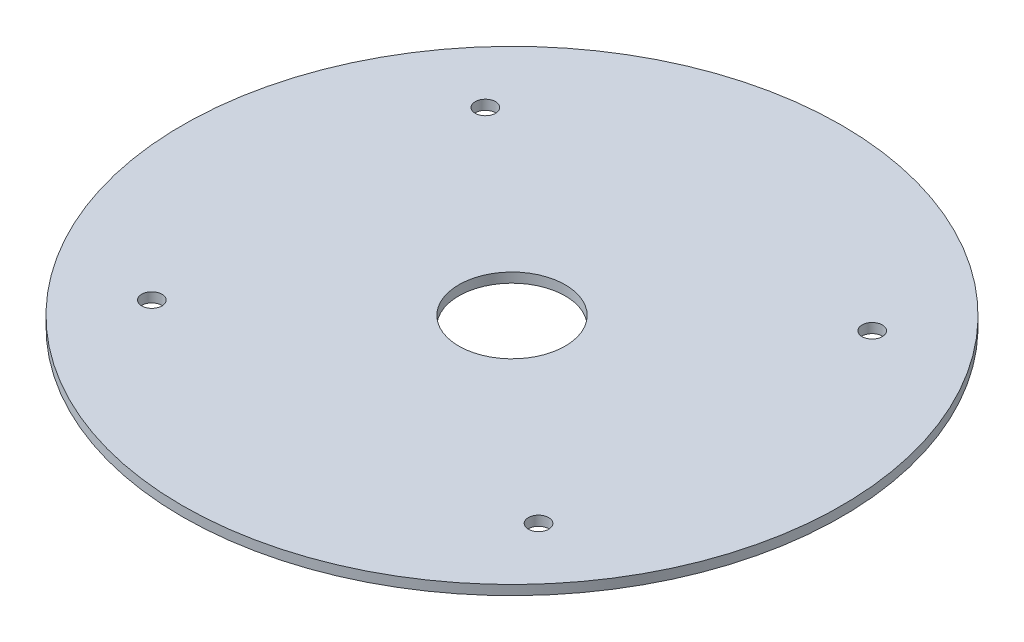
ISO-10303-21;
HEADER;
FILE_DESCRIPTION(('STEP AP214'),'2;1');
FILE_NAME('part.step','',(''),(''),'','','');
FILE_SCHEMA(('AUTOMOTIVE_DESIGN { 1 0 10303 214 1 1 1 1 }'));
ENDSEC;
DATA;
#1=APPLICATION_CONTEXT('core data for automotive mechanical design processes');
#2=APPLICATION_PROTOCOL_DEFINITION('international standard','automotive_design',2000,#1);
#3=PRODUCT_CONTEXT('',#1,'mechanical');
#4=PRODUCT('Part','Part','',(#3));
#5=PRODUCT_RELATED_PRODUCT_CATEGORY('part','',(#4));
#6=PRODUCT_DEFINITION_FORMATION('','',#4);
#7=PRODUCT_DEFINITION_CONTEXT('part definition',#1,'design');
#8=PRODUCT_DEFINITION('design','',#6,#7);
#9=PRODUCT_DEFINITION_SHAPE('','',#8);
#10=(LENGTH_UNIT() NAMED_UNIT(*) SI_UNIT(.MILLI.,.METRE.));
#11=(NAMED_UNIT(*) PLANE_ANGLE_UNIT() SI_UNIT($,.RADIAN.));
#12=(NAMED_UNIT(*) SI_UNIT($,.STERADIAN.) SOLID_ANGLE_UNIT());
#13=UNCERTAINTY_MEASURE_WITH_UNIT(LENGTH_MEASURE(1.E-05),#10,'distance_accuracy_value','');
#14=(GEOMETRIC_REPRESENTATION_CONTEXT(3) GLOBAL_UNCERTAINTY_ASSIGNED_CONTEXT((#13)) GLOBAL_UNIT_ASSIGNED_CONTEXT((#10,
#11,#12)) REPRESENTATION_CONTEXT('',''));
#15=CARTESIAN_POINT('',(0.,0.,0.));
#16=DIRECTION('',(0.,0.,1.));
#17=DIRECTION('',(1.,0.,0.));
#18=AXIS2_PLACEMENT_3D('',#15,#16,#17);
#19=CARTESIAN_POINT('',(6.79138855438484,2.,-8.0652010270864));
#20=DIRECTION('',(0.,1.,0.));
#21=DIRECTION('',(0.,0.,1.));
#22=AXIS2_PLACEMENT_3D('',#19,#20,#21);
#23=PLANE('',#22);
#24=CARTESIAN_POINT('',(-33.2088446067296,2.,26.4347989729135));
#25=DIRECTION('',(0.,1.,0.));
#26=DIRECTION('',(0.,0.,1.));
#27=AXIS2_PLACEMENT_3D('',#24,#25,#26);
#28=CIRCLE('',#27,2.1);
#29=CARTESIAN_POINT('',(-33.2088446067296,2.,28.5347989729135));
#30=VERTEX_POINT('',#29);
#31=EDGE_CURVE('E62',#30,#30,#28,.T.);
#32=ORIENTED_EDGE('',*,*,#31,.F.);
#33=EDGE_LOOP('',(#32));
#34=FACE_BOUND('',#33,.T.);
#35=CARTESIAN_POINT('',(-33.2088446067296,2.,-42.5652010270864));
#36=DIRECTION('',(0.,1.,0.));
#37=DIRECTION('',(0.,0.,1.));
#38=AXIS2_PLACEMENT_3D('',#35,#36,#37);
#39=CIRCLE('',#38,2.1);
#40=CARTESIAN_POINT('',(-33.2088446067296,2.,-40.4652010270864));
#41=VERTEX_POINT('',#40);
#42=EDGE_CURVE('E50',#41,#41,#39,.T.);
#43=ORIENTED_EDGE('',*,*,#42,.F.);
#44=EDGE_LOOP('',(#43));
#45=FACE_BOUND('',#44,.T.);
#46=CARTESIAN_POINT('',(6.79138855438484,2.,-8.0652010270864));
#47=DIRECTION('',(0.,1.,0.));
#48=DIRECTION('',(0.,0.,1.));
#49=AXIS2_PLACEMENT_3D('',#46,#47,#48);
#50=CIRCLE('',#49,68.1690216964452);
#51=CARTESIAN_POINT('',(6.79138855438484,2.,60.1038206693588));
#52=VERTEX_POINT('',#51);
#53=EDGE_CURVE('E10',#52,#52,#50,.T.);
#54=ORIENTED_EDGE('',*,*,#53,.T.);
#55=EDGE_LOOP('',(#54));
#56=FACE_BOUND('',#55,.T.);
#57=CARTESIAN_POINT('',(6.79138855438484,2.,-8.0652010270864));
#58=DIRECTION('',(0.,1.,0.));
#59=DIRECTION('',(0.,0.,1.));
#60=AXIS2_PLACEMENT_3D('',#57,#58,#59);
#61=CIRCLE('',#60,11.);
#62=CARTESIAN_POINT('',(6.79138855438484,2.,2.9347989729136));
#63=VERTEX_POINT('',#62);
#64=EDGE_CURVE('E45',#63,#63,#61,.T.);
#65=ORIENTED_EDGE('',*,*,#64,.F.);
#66=EDGE_LOOP('',(#65));
#67=FACE_BOUND('',#66,.T.);
#68=CARTESIAN_POINT('',(46.7916217154993,2.,-42.5652010270864));
#69=DIRECTION('',(0.,1.,0.));
#70=DIRECTION('',(0.,0.,1.));
#71=AXIS2_PLACEMENT_3D('',#68,#69,#70);
#72=CIRCLE('',#71,2.1);
#73=CARTESIAN_POINT('',(46.7916217154993,2.,-40.4652010270864));
#74=VERTEX_POINT('',#73);
#75=EDGE_CURVE('E56',#74,#74,#72,.T.);
#76=ORIENTED_EDGE('',*,*,#75,.F.);
#77=EDGE_LOOP('',(#76));
#78=FACE_BOUND('',#77,.T.);
#79=CARTESIAN_POINT('',(46.7960018184228,2.,26.4508327700433));
#80=DIRECTION('',(0.,1.,0.));
#81=DIRECTION('',(0.,0.,1.));
#82=AXIS2_PLACEMENT_3D('',#79,#80,#81);
#83=CIRCLE('',#82,2.1);
#84=CARTESIAN_POINT('',(46.7960018184228,2.,28.5508327700433));
#85=VERTEX_POINT('',#84);
#86=EDGE_CURVE('E68',#85,#85,#83,.T.);
#87=ORIENTED_EDGE('',*,*,#86,.F.);
#88=EDGE_LOOP('',(#87));
#89=FACE_BOUND('',#88,.T.);
#90=ADVANCED_FACE('F34',(#34,#45,#56,#67,#78,#89),#23,.T.);
#91=CARTESIAN_POINT('',(6.79138855438484,0.,-8.0652010270864));
#92=DIRECTION('',(0.,1.,0.));
#93=DIRECTION('',(0.,0.,1.));
#94=AXIS2_PLACEMENT_3D('',#91,#92,#93);
#95=PLANE('',#94);
#96=CARTESIAN_POINT('',(6.79138855438484,0.,-8.0652010270864));
#97=DIRECTION('',(0.,1.,0.));
#98=DIRECTION('',(0.,0.,1.));
#99=AXIS2_PLACEMENT_3D('',#96,#97,#98);
#100=CIRCLE('',#99,68.1690216964452);
#101=CARTESIAN_POINT('',(6.79138855438484,0.,60.1038206693588));
#102=VERTEX_POINT('',#101);
#103=EDGE_CURVE('E38',#102,#102,#100,.T.);
#104=ORIENTED_EDGE('',*,*,#103,.F.);
#105=EDGE_LOOP('',(#104));
#106=FACE_BOUND('',#105,.T.);
#107=CARTESIAN_POINT('',(6.79138855438484,0.,-8.0652010270864));
#108=DIRECTION('',(0.,1.,0.));
#109=DIRECTION('',(0.,0.,1.));
#110=AXIS2_PLACEMENT_3D('',#107,#108,#109);
#111=CIRCLE('',#110,11.);
#112=CARTESIAN_POINT('',(6.79138855438484,0.,2.9347989729136));
#113=VERTEX_POINT('',#112);
#114=EDGE_CURVE('E47',#113,#113,#111,.T.);
#115=ORIENTED_EDGE('',*,*,#114,.T.);
#116=EDGE_LOOP('',(#115));
#117=FACE_BOUND('',#116,.T.);
#118=CARTESIAN_POINT('',(-33.2088446067296,0.,-42.5652010270864));
#119=DIRECTION('',(0.,1.,0.));
#120=DIRECTION('',(0.,0.,1.));
#121=AXIS2_PLACEMENT_3D('',#118,#119,#120);
#122=CIRCLE('',#121,2.1);
#123=CARTESIAN_POINT('',(-33.2088446067296,0.,-40.4652010270864));
#124=VERTEX_POINT('',#123);
#125=EDGE_CURVE('E53',#124,#124,#122,.T.);
#126=ORIENTED_EDGE('',*,*,#125,.T.);
#127=EDGE_LOOP('',(#126));
#128=FACE_BOUND('',#127,.T.);
#129=CARTESIAN_POINT('',(46.7916217154993,0.,-42.5652010270864));
#130=DIRECTION('',(0.,1.,0.));
#131=DIRECTION('',(0.,0.,1.));
#132=AXIS2_PLACEMENT_3D('',#129,#130,#131);
#133=CIRCLE('',#132,2.1);
#134=CARTESIAN_POINT('',(46.7916217154993,0.,-40.4652010270864));
#135=VERTEX_POINT('',#134);
#136=EDGE_CURVE('E59',#135,#135,#133,.T.);
#137=ORIENTED_EDGE('',*,*,#136,.T.);
#138=EDGE_LOOP('',(#137));
#139=FACE_BOUND('',#138,.T.);
#140=CARTESIAN_POINT('',(-33.2088446067296,0.,26.4347989729135));
#141=DIRECTION('',(0.,1.,0.));
#142=DIRECTION('',(0.,0.,1.));
#143=AXIS2_PLACEMENT_3D('',#140,#141,#142);
#144=CIRCLE('',#143,2.1);
#145=CARTESIAN_POINT('',(-33.2088446067296,0.,28.5347989729135));
#146=VERTEX_POINT('',#145);
#147=EDGE_CURVE('E65',#146,#146,#144,.T.);
#148=ORIENTED_EDGE('',*,*,#147,.T.);
#149=EDGE_LOOP('',(#148));
#150=FACE_BOUND('',#149,.T.);
#151=CARTESIAN_POINT('',(46.7960018184228,0.,26.4508327700433));
#152=DIRECTION('',(0.,1.,0.));
#153=DIRECTION('',(0.,0.,1.));
#154=AXIS2_PLACEMENT_3D('',#151,#152,#153);
#155=CIRCLE('',#154,2.1);
#156=CARTESIAN_POINT('',(46.7960018184228,0.,28.5508327700433));
#157=VERTEX_POINT('',#156);
#158=EDGE_CURVE('E71',#157,#157,#155,.T.);
#159=ORIENTED_EDGE('',*,*,#158,.T.);
#160=EDGE_LOOP('',(#159));
#161=FACE_BOUND('',#160,.T.);
#162=ADVANCED_FACE('F81',(#106,#117,#128,#139,#150,#161),#95,.F.);
#163=CARTESIAN_POINT('',(6.79138855438484,2.,-8.0652010270864));
#164=DIRECTION('',(0.,-1.,0.));
#165=DIRECTION('',(0.,0.,-1.));
#166=AXIS2_PLACEMENT_3D('',#163,#164,#165);
#167=CYLINDRICAL_SURFACE('',#166,68.1690216964452);
#168=ORIENTED_EDGE('',*,*,#53,.F.);
#169=EDGE_LOOP('',(#168));
#170=FACE_BOUND('',#169,.T.);
#171=ORIENTED_EDGE('',*,*,#103,.T.);
#172=EDGE_LOOP('',(#171));
#173=FACE_BOUND('',#172,.T.);
#174=ADVANCED_FACE('F36',(#170,#173),#167,.T.);
#175=CARTESIAN_POINT('',(6.79138855438484,2.,-8.0652010270864));
#176=DIRECTION('',(0.,-1.,0.));
#177=DIRECTION('',(0.,0.,-1.));
#178=AXIS2_PLACEMENT_3D('',#175,#176,#177);
#179=CYLINDRICAL_SURFACE('',#178,11.);
#180=ORIENTED_EDGE('',*,*,#64,.T.);
#181=EDGE_LOOP('',(#180));
#182=FACE_BOUND('',#181,.T.);
#183=ORIENTED_EDGE('',*,*,#114,.F.);
#184=EDGE_LOOP('',(#183));
#185=FACE_BOUND('',#184,.T.);
#186=ADVANCED_FACE('F91',(#182,#185),#179,.F.);
#187=CARTESIAN_POINT('',(-33.2088446067296,2.,-42.5652010270864));
#188=DIRECTION('',(0.,-1.,0.));
#189=DIRECTION('',(0.,0.,-1.));
#190=AXIS2_PLACEMENT_3D('',#187,#188,#189);
#191=CYLINDRICAL_SURFACE('',#190,2.1);
#192=ORIENTED_EDGE('',*,*,#42,.T.);
#193=EDGE_LOOP('',(#192));
#194=FACE_BOUND('',#193,.T.);
#195=ORIENTED_EDGE('',*,*,#125,.F.);
#196=EDGE_LOOP('',(#195));
#197=FACE_BOUND('',#196,.T.);
#198=ADVANCED_FACE('F94',(#194,#197),#191,.F.);
#199=CARTESIAN_POINT('',(46.7916217154993,2.,-42.5652010270864));
#200=DIRECTION('',(0.,-1.,0.));
#201=DIRECTION('',(0.,0.,-1.));
#202=AXIS2_PLACEMENT_3D('',#199,#200,#201);
#203=CYLINDRICAL_SURFACE('',#202,2.1);
#204=ORIENTED_EDGE('',*,*,#75,.T.);
#205=EDGE_LOOP('',(#204));
#206=FACE_BOUND('',#205,.T.);
#207=ORIENTED_EDGE('',*,*,#136,.F.);
#208=EDGE_LOOP('',(#207));
#209=FACE_BOUND('',#208,.T.);
#210=ADVANCED_FACE('F98',(#206,#209),#203,.F.);
#211=CARTESIAN_POINT('',(-33.2088446067296,2.,26.4347989729135));
#212=DIRECTION('',(0.,-1.,0.));
#213=DIRECTION('',(0.,0.,-1.));
#214=AXIS2_PLACEMENT_3D('',#211,#212,#213);
#215=CYLINDRICAL_SURFACE('',#214,2.1);
#216=ORIENTED_EDGE('',*,*,#31,.T.);
#217=EDGE_LOOP('',(#216));
#218=FACE_BOUND('',#217,.T.);
#219=ORIENTED_EDGE('',*,*,#147,.F.);
#220=EDGE_LOOP('',(#219));
#221=FACE_BOUND('',#220,.T.);
#222=ADVANCED_FACE('F102',(#218,#221),#215,.F.);
#223=CARTESIAN_POINT('',(46.7960018184228,2.,26.4508327700433));
#224=DIRECTION('',(0.,-1.,0.));
#225=DIRECTION('',(0.,0.,-1.));
#226=AXIS2_PLACEMENT_3D('',#223,#224,#225);
#227=CYLINDRICAL_SURFACE('',#226,2.1);
#228=ORIENTED_EDGE('',*,*,#86,.T.);
#229=EDGE_LOOP('',(#228));
#230=FACE_BOUND('',#229,.T.);
#231=ORIENTED_EDGE('',*,*,#158,.F.);
#232=EDGE_LOOP('',(#231));
#233=FACE_BOUND('',#232,.T.);
#234=ADVANCED_FACE('F77',(#230,#233),#227,.F.);
#235=CLOSED_SHELL('',(#90,#162,#174,#186,#198,#210,#222,#234));
#236=MANIFOLD_SOLID_BREP('B2',#235);
#237=ADVANCED_BREP_SHAPE_REPRESENTATION('',(#18,#236),#14);
#238=SHAPE_DEFINITION_REPRESENTATION(#9,#237);
ENDSEC;
END-ISO-10303-21;
